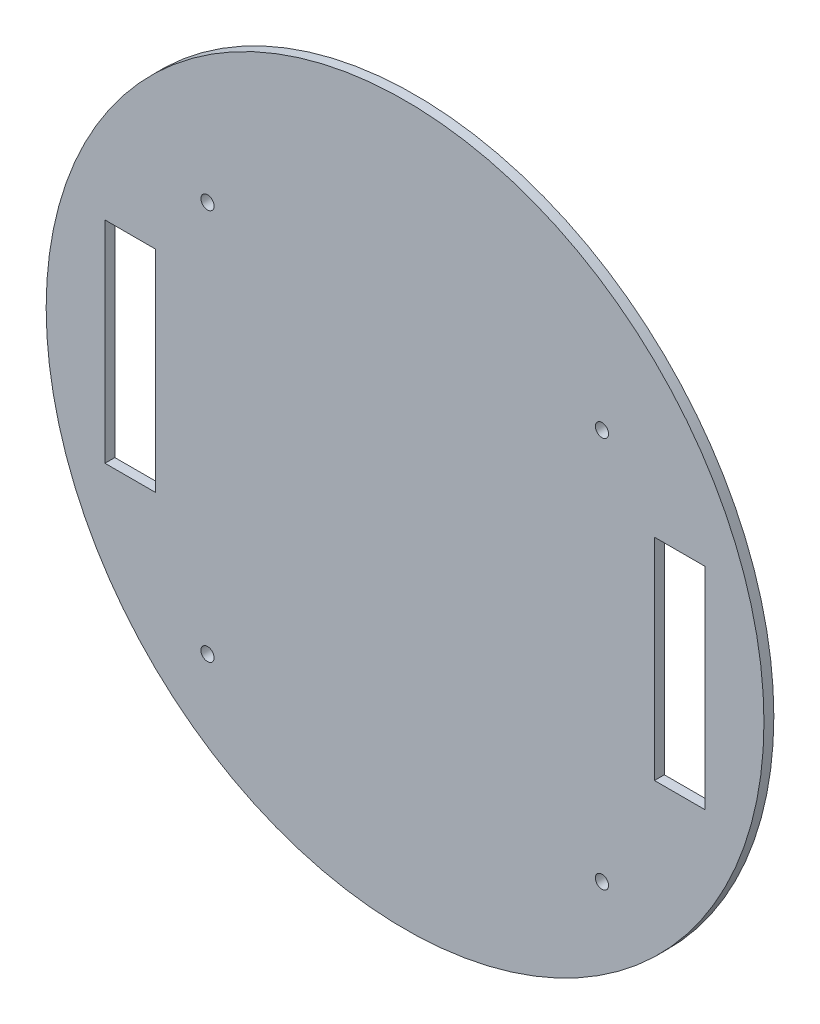
ISO-10303-21;
HEADER;
FILE_DESCRIPTION(('STEP AP214'),'2;1');
FILE_NAME('part.step','',(''),(''),'','','');
FILE_SCHEMA(('AUTOMOTIVE_DESIGN { 1 0 10303 214 1 1 1 1 }'));
ENDSEC;
DATA;
#1=APPLICATION_CONTEXT('core data for automotive mechanical design processes');
#2=APPLICATION_PROTOCOL_DEFINITION('international standard','automotive_design',2000,#1);
#3=PRODUCT_CONTEXT('',#1,'mechanical');
#4=PRODUCT('Part','Part','',(#3));
#5=PRODUCT_RELATED_PRODUCT_CATEGORY('part','',(#4));
#6=PRODUCT_DEFINITION_FORMATION('','',#4);
#7=PRODUCT_DEFINITION_CONTEXT('part definition',#1,'design');
#8=PRODUCT_DEFINITION('design','',#6,#7);
#9=PRODUCT_DEFINITION_SHAPE('','',#8);
#10=(LENGTH_UNIT() NAMED_UNIT(*) SI_UNIT(.MILLI.,.METRE.));
#11=(NAMED_UNIT(*) PLANE_ANGLE_UNIT() SI_UNIT($,.RADIAN.));
#12=(NAMED_UNIT(*) SI_UNIT($,.STERADIAN.) SOLID_ANGLE_UNIT());
#13=UNCERTAINTY_MEASURE_WITH_UNIT(LENGTH_MEASURE(1.E-05),#10,'distance_accuracy_value','');
#14=(GEOMETRIC_REPRESENTATION_CONTEXT(3) GLOBAL_UNCERTAINTY_ASSIGNED_CONTEXT((#13)) GLOBAL_UNIT_ASSIGNED_CONTEXT((#10,
#11,#12)) REPRESENTATION_CONTEXT('',''));
#15=CARTESIAN_POINT('',(0.,0.,0.));
#16=DIRECTION('',(0.,0.,1.));
#17=DIRECTION('',(1.,0.,0.));
#18=AXIS2_PLACEMENT_3D('',#15,#16,#17);
#19=CARTESIAN_POINT('',(0.,0.,1.5));
#20=DIRECTION('',(0.,0.,-1.));
#21=DIRECTION('',(-1.,0.,0.));
#22=AXIS2_PLACEMENT_3D('',#19,#20,#21);
#23=CYLINDRICAL_SURFACE('',#22,54.5);
#24=CARTESIAN_POINT('',(0.,0.,1.5));
#25=DIRECTION('',(0.,0.,1.));
#26=DIRECTION('',(1.,0.,0.));
#27=AXIS2_PLACEMENT_3D('',#24,#25,#26);
#28=CIRCLE('',#27,54.5);
#29=CARTESIAN_POINT('',(54.5,0.,1.5));
#30=VERTEX_POINT('',#29);
#31=EDGE_CURVE('E11',#30,#30,#28,.T.);
#32=ORIENTED_EDGE('',*,*,#31,.F.);
#33=EDGE_LOOP('',(#32));
#34=FACE_BOUND('',#33,.T.);
#35=CARTESIAN_POINT('',(0.,0.,0.));
#36=DIRECTION('',(0.,0.,1.));
#37=DIRECTION('',(1.,0.,0.));
#38=AXIS2_PLACEMENT_3D('',#35,#36,#37);
#39=CIRCLE('',#38,54.5);
#40=CARTESIAN_POINT('',(54.5,0.,0.));
#41=VERTEX_POINT('',#40);
#42=EDGE_CURVE('E42',#41,#41,#39,.T.);
#43=ORIENTED_EDGE('',*,*,#42,.T.);
#44=EDGE_LOOP('',(#43));
#45=FACE_BOUND('',#44,.T.);
#46=ADVANCED_FACE('F34',(#34,#45),#23,.T.);
#47=CARTESIAN_POINT('',(0.,0.,1.5));
#48=DIRECTION('',(0.,0.,1.));
#49=DIRECTION('',(1.,0.,0.));
#50=AXIS2_PLACEMENT_3D('',#47,#48,#49);
#51=PLANE('',#50);
#52=DIRECTION('',(0.,-1.,0.));
#53=VECTOR('',#52,1.);
#54=CARTESIAN_POINT('',(-45.5705,-16.,1.5));
#55=LINE('',#54,#53);
#56=CARTESIAN_POINT('',(-45.5705,16.,1.5));
#57=VERTEX_POINT('',#56);
#58=CARTESIAN_POINT('',(-45.5705,-16.,1.5));
#59=VERTEX_POINT('',#58);
#60=EDGE_CURVE('E50',#57,#59,#55,.T.);
#61=ORIENTED_EDGE('',*,*,#60,.F.);
#62=DIRECTION('',(-1.,0.,0.));
#63=VECTOR('',#62,1.);
#64=CARTESIAN_POINT('',(-45.5705,16.,1.5));
#65=LINE('',#64,#63);
#66=CARTESIAN_POINT('',(-37.8705,16.,1.5));
#67=VERTEX_POINT('',#66);
#68=EDGE_CURVE('E119',#67,#57,#65,.T.);
#69=ORIENTED_EDGE('',*,*,#68,.F.);
#70=DIRECTION('',(0.,1.,0.));
#71=VECTOR('',#70,1.);
#72=CARTESIAN_POINT('',(-37.8705,-16.,1.5));
#73=LINE('',#72,#71);
#74=CARTESIAN_POINT('',(-37.8705,-16.,1.5));
#75=VERTEX_POINT('',#74);
#76=EDGE_CURVE('E103',#75,#67,#73,.T.);
#77=ORIENTED_EDGE('',*,*,#76,.F.);
#78=DIRECTION('',(1.,0.,0.));
#79=VECTOR('',#78,1.);
#80=CARTESIAN_POINT('',(-45.5705,-16.,1.5));
#81=LINE('',#80,#79);
#82=EDGE_CURVE('E112',#59,#75,#81,.T.);
#83=ORIENTED_EDGE('',*,*,#82,.F.);
#84=EDGE_LOOP('',(#61,#69,#77,#83));
#85=FACE_BOUND('',#84,.T.);
#86=DIRECTION('',(0.,1.,0.));
#87=VECTOR('',#86,1.);
#88=CARTESIAN_POINT('',(45.5705,-16.,1.5));
#89=LINE('',#88,#87);
#90=CARTESIAN_POINT('',(45.5705,-16.,1.5));
#91=VERTEX_POINT('',#90);
#92=CARTESIAN_POINT('',(45.5705,16.,1.5));
#93=VERTEX_POINT('',#92);
#94=EDGE_CURVE('E130',#91,#93,#89,.T.);
#95=ORIENTED_EDGE('',*,*,#94,.F.);
#96=DIRECTION('',(1.,0.,0.));
#97=VECTOR('',#96,1.);
#98=CARTESIAN_POINT('',(45.5705,-16.,1.5));
#99=LINE('',#98,#97);
#100=CARTESIAN_POINT('',(37.8705,-16.,1.5));
#101=VERTEX_POINT('',#100);
#102=EDGE_CURVE('E148',#101,#91,#99,.T.);
#103=ORIENTED_EDGE('',*,*,#102,.F.);
#104=DIRECTION('',(0.,-1.,0.));
#105=VECTOR('',#104,1.);
#106=CARTESIAN_POINT('',(37.8705,-16.,1.5));
#107=LINE('',#106,#105);
#108=CARTESIAN_POINT('',(37.8705,16.,1.5));
#109=VERTEX_POINT('',#108);
#110=EDGE_CURVE('E145',#109,#101,#107,.T.);
#111=ORIENTED_EDGE('',*,*,#110,.F.);
#112=DIRECTION('',(-1.,0.,0.));
#113=VECTOR('',#112,1.);
#114=CARTESIAN_POINT('',(45.5705,16.,1.5));
#115=LINE('',#114,#113);
#116=EDGE_CURVE('E142',#93,#109,#115,.T.);
#117=ORIENTED_EDGE('',*,*,#116,.F.);
#118=EDGE_LOOP('',(#95,#103,#111,#117));
#119=FACE_BOUND('',#118,.T.);
#120=CARTESIAN_POINT('',(-29.9996014159269,26.1,1.5));
#121=DIRECTION('',(0.,0.,1.));
#122=DIRECTION('',(1.,0.,0.));
#123=AXIS2_PLACEMENT_3D('',#120,#121,#122);
#124=CIRCLE('',#123,1.);
#125=CARTESIAN_POINT('',(-28.9996014159269,26.1,1.5));
#126=VERTEX_POINT('',#125);
#127=EDGE_CURVE('E160',#126,#126,#124,.T.);
#128=ORIENTED_EDGE('',*,*,#127,.F.);
#129=EDGE_LOOP('',(#128));
#130=FACE_BOUND('',#129,.T.);
#131=CARTESIAN_POINT('',(-29.9996014159269,-33.3,1.5));
#132=DIRECTION('',(0.,0.,1.));
#133=DIRECTION('',(1.,0.,0.));
#134=AXIS2_PLACEMENT_3D('',#131,#132,#133);
#135=CIRCLE('',#134,1.);
#136=CARTESIAN_POINT('',(-28.9996014159269,-33.3,1.5));
#137=VERTEX_POINT('',#136);
#138=EDGE_CURVE('E163',#137,#137,#135,.T.);
#139=ORIENTED_EDGE('',*,*,#138,.F.);
#140=EDGE_LOOP('',(#139));
#141=FACE_BOUND('',#140,.T.);
#142=CARTESIAN_POINT('',(29.9003985840731,-33.3,1.5));
#143=DIRECTION('',(0.,0.,1.));
#144=DIRECTION('',(1.,0.,0.));
#145=AXIS2_PLACEMENT_3D('',#142,#143,#144);
#146=CIRCLE('',#145,0.999999999999995);
#147=CARTESIAN_POINT('',(30.9003985840731,-33.3,1.5));
#148=VERTEX_POINT('',#147);
#149=EDGE_CURVE('E167',#148,#148,#146,.T.);
#150=ORIENTED_EDGE('',*,*,#149,.F.);
#151=EDGE_LOOP('',(#150));
#152=FACE_BOUND('',#151,.T.);
#153=CARTESIAN_POINT('',(29.900398584073,26.1,1.5));
#154=DIRECTION('',(0.,0.,1.));
#155=DIRECTION('',(1.,0.,0.));
#156=AXIS2_PLACEMENT_3D('',#153,#154,#155);
#157=CIRCLE('',#156,0.999999999999994);
#158=CARTESIAN_POINT('',(30.900398584073,26.1,1.5));
#159=VERTEX_POINT('',#158);
#160=EDGE_CURVE('E171',#159,#159,#157,.T.);
#161=ORIENTED_EDGE('',*,*,#160,.F.);
#162=EDGE_LOOP('',(#161));
#163=FACE_BOUND('',#162,.T.);
#164=ORIENTED_EDGE('',*,*,#31,.T.);
#165=EDGE_LOOP('',(#164));
#166=FACE_BOUND('',#165,.T.);
#167=ADVANCED_FACE('F116',(#85,#119,#130,#141,#152,#163,#166),#51,.T.);
#168=CARTESIAN_POINT('',(0.,0.,0.));
#169=DIRECTION('',(0.,0.,1.));
#170=DIRECTION('',(1.,0.,0.));
#171=AXIS2_PLACEMENT_3D('',#168,#169,#170);
#172=PLANE('',#171);
#173=DIRECTION('',(1.,0.,0.));
#174=VECTOR('',#173,1.);
#175=CARTESIAN_POINT('',(-45.5705,16.,0.));
#176=LINE('',#175,#174);
#177=CARTESIAN_POINT('',(-45.5705,16.,0.));
#178=VERTEX_POINT('',#177);
#179=CARTESIAN_POINT('',(-37.8705,16.,0.));
#180=VERTEX_POINT('',#179);
#181=EDGE_CURVE('E222',#178,#180,#176,.T.);
#182=ORIENTED_EDGE('',*,*,#181,.F.);
#183=DIRECTION('',(0.,1.,0.));
#184=VECTOR('',#183,1.);
#185=CARTESIAN_POINT('',(-45.5705,-16.,0.));
#186=LINE('',#185,#184);
#187=CARTESIAN_POINT('',(-45.5705,-16.,0.));
#188=VERTEX_POINT('',#187);
#189=EDGE_CURVE('E131',#188,#178,#186,.T.);
#190=ORIENTED_EDGE('',*,*,#189,.F.);
#191=DIRECTION('',(-1.,0.,0.));
#192=VECTOR('',#191,1.);
#193=CARTESIAN_POINT('',(-45.5705,-16.,0.));
#194=LINE('',#193,#192);
#195=CARTESIAN_POINT('',(-37.8705,-16.,0.));
#196=VERTEX_POINT('',#195);
#197=EDGE_CURVE('E128',#196,#188,#194,.T.);
#198=ORIENTED_EDGE('',*,*,#197,.F.);
#199=DIRECTION('',(0.,-1.,0.));
#200=VECTOR('',#199,1.);
#201=CARTESIAN_POINT('',(-37.8705,-16.,0.));
#202=LINE('',#201,#200);
#203=EDGE_CURVE('E106',#180,#196,#202,.T.);
#204=ORIENTED_EDGE('',*,*,#203,.F.);
#205=EDGE_LOOP('',(#182,#190,#198,#204));
#206=FACE_BOUND('',#205,.T.);
#207=DIRECTION('',(-1.,0.,0.));
#208=VECTOR('',#207,1.);
#209=CARTESIAN_POINT('',(45.5705,-16.,0.));
#210=LINE('',#209,#208);
#211=CARTESIAN_POINT('',(45.5705,-16.,0.));
#212=VERTEX_POINT('',#211);
#213=CARTESIAN_POINT('',(37.8705,-16.,0.));
#214=VERTEX_POINT('',#213);
#215=EDGE_CURVE('E135',#212,#214,#210,.T.);
#216=ORIENTED_EDGE('',*,*,#215,.F.);
#217=DIRECTION('',(0.,-1.,0.));
#218=VECTOR('',#217,1.);
#219=CARTESIAN_POINT('',(45.5705,-16.,0.));
#220=LINE('',#219,#218);
#221=CARTESIAN_POINT('',(45.5705,16.,0.));
#222=VERTEX_POINT('',#221);
#223=EDGE_CURVE('E138',#222,#212,#220,.T.);
#224=ORIENTED_EDGE('',*,*,#223,.F.);
#225=DIRECTION('',(1.,0.,0.));
#226=VECTOR('',#225,1.);
#227=CARTESIAN_POINT('',(45.5705,16.,0.));
#228=LINE('',#227,#226);
#229=CARTESIAN_POINT('',(37.8705,16.,0.));
#230=VERTEX_POINT('',#229);
#231=EDGE_CURVE('E140',#230,#222,#228,.T.);
#232=ORIENTED_EDGE('',*,*,#231,.F.);
#233=DIRECTION('',(0.,1.,0.));
#234=VECTOR('',#233,1.);
#235=CARTESIAN_POINT('',(37.8705,-16.,0.));
#236=LINE('',#235,#234);
#237=EDGE_CURVE('E132',#214,#230,#236,.T.);
#238=ORIENTED_EDGE('',*,*,#237,.F.);
#239=EDGE_LOOP('',(#216,#224,#232,#238));
#240=FACE_BOUND('',#239,.T.);
#241=CARTESIAN_POINT('',(-29.9996014159269,26.1,0.));
#242=DIRECTION('',(0.,0.,1.));
#243=DIRECTION('',(1.,0.,0.));
#244=AXIS2_PLACEMENT_3D('',#241,#242,#243);
#245=CIRCLE('',#244,1.);
#246=CARTESIAN_POINT('',(-28.9996014159269,26.1,0.));
#247=VERTEX_POINT('',#246);
#248=EDGE_CURVE('E37',#247,#247,#245,.T.);
#249=ORIENTED_EDGE('',*,*,#248,.T.);
#250=EDGE_LOOP('',(#249));
#251=FACE_BOUND('',#250,.T.);
#252=CARTESIAN_POINT('',(-29.9996014159269,-33.3,0.));
#253=DIRECTION('',(0.,0.,1.));
#254=DIRECTION('',(1.,0.,0.));
#255=AXIS2_PLACEMENT_3D('',#252,#253,#254);
#256=CIRCLE('',#255,1.);
#257=CARTESIAN_POINT('',(-28.9996014159269,-33.3,0.));
#258=VERTEX_POINT('',#257);
#259=EDGE_CURVE('E166',#258,#258,#256,.T.);
#260=ORIENTED_EDGE('',*,*,#259,.T.);
#261=EDGE_LOOP('',(#260));
#262=FACE_BOUND('',#261,.T.);
#263=CARTESIAN_POINT('',(29.9003985840731,-33.3,0.));
#264=DIRECTION('',(0.,0.,1.));
#265=DIRECTION('',(1.,0.,0.));
#266=AXIS2_PLACEMENT_3D('',#263,#264,#265);
#267=CIRCLE('',#266,0.999999999999995);
#268=CARTESIAN_POINT('',(30.9003985840731,-33.3,0.));
#269=VERTEX_POINT('',#268);
#270=EDGE_CURVE('E170',#269,#269,#267,.T.);
#271=ORIENTED_EDGE('',*,*,#270,.T.);
#272=EDGE_LOOP('',(#271));
#273=FACE_BOUND('',#272,.T.);
#274=CARTESIAN_POINT('',(29.900398584073,26.1,0.));
#275=DIRECTION('',(0.,0.,1.));
#276=DIRECTION('',(1.,0.,0.));
#277=AXIS2_PLACEMENT_3D('',#274,#275,#276);
#278=CIRCLE('',#277,0.999999999999994);
#279=CARTESIAN_POINT('',(30.900398584073,26.1,0.));
#280=VERTEX_POINT('',#279);
#281=EDGE_CURVE('E173',#280,#280,#278,.T.);
#282=ORIENTED_EDGE('',*,*,#281,.T.);
#283=EDGE_LOOP('',(#282));
#284=FACE_BOUND('',#283,.T.);
#285=ORIENTED_EDGE('',*,*,#42,.F.);
#286=EDGE_LOOP('',(#285));
#287=FACE_BOUND('',#286,.T.);
#288=ADVANCED_FACE('F183',(#206,#240,#251,#262,#273,#284,#287),#172,.F.);
#289=CARTESIAN_POINT('',(29.900398584073,26.1,-0.08));
#290=DIRECTION('',(0.,0.,1.));
#291=DIRECTION('',(1.,0.,0.));
#292=AXIS2_PLACEMENT_3D('',#289,#290,#291);
#293=CYLINDRICAL_SURFACE('',#292,0.999999999999994);
#294=CARTESIAN_POINT('',(30.900398584073,26.1,1.5));
#295=CARTESIAN_POINT('',(30.900398584073,26.1,1.484375));
#296=CARTESIAN_POINT('',(30.900398584073,26.1,1.46875));
#297=CARTESIAN_POINT('',(30.900398584073,26.1,1.4375));
#298=CARTESIAN_POINT('',(30.900398584073,26.1,1.421875));
#299=CARTESIAN_POINT('',(30.900398584073,26.1,1.390625));
#300=CARTESIAN_POINT('',(30.900398584073,26.1,1.375));
#301=CARTESIAN_POINT('',(30.900398584073,26.1,1.34375));
#302=CARTESIAN_POINT('',(30.900398584073,26.1,1.328125));
#303=CARTESIAN_POINT('',(30.900398584073,26.1,1.296875));
#304=CARTESIAN_POINT('',(30.900398584073,26.1,1.28125));
#305=CARTESIAN_POINT('',(30.900398584073,26.1,1.25));
#306=CARTESIAN_POINT('',(30.900398584073,26.1,1.234375));
#307=CARTESIAN_POINT('',(30.900398584073,26.1,1.203125));
#308=CARTESIAN_POINT('',(30.900398584073,26.1,1.1875));
#309=CARTESIAN_POINT('',(30.900398584073,26.1,1.15625));
#310=CARTESIAN_POINT('',(30.900398584073,26.1,1.140625));
#311=CARTESIAN_POINT('',(30.900398584073,26.1,1.109375));
#312=CARTESIAN_POINT('',(30.900398584073,26.1,1.09375));
#313=CARTESIAN_POINT('',(30.900398584073,26.1,1.0625));
#314=CARTESIAN_POINT('',(30.900398584073,26.1,1.046875));
#315=CARTESIAN_POINT('',(30.900398584073,26.1,1.015625));
#316=CARTESIAN_POINT('',(30.900398584073,26.1,1.));
#317=CARTESIAN_POINT('',(30.900398584073,26.1,0.96875));
#318=CARTESIAN_POINT('',(30.900398584073,26.1,0.953125));
#319=CARTESIAN_POINT('',(30.900398584073,26.1,0.921875));
#320=CARTESIAN_POINT('',(30.900398584073,26.1,0.90625));
#321=CARTESIAN_POINT('',(30.900398584073,26.1,0.875));
#322=CARTESIAN_POINT('',(30.900398584073,26.1,0.859375));
#323=CARTESIAN_POINT('',(30.900398584073,26.1,0.828125));
#324=CARTESIAN_POINT('',(30.900398584073,26.1,0.8125));
#325=CARTESIAN_POINT('',(30.900398584073,26.1,0.78125));
#326=CARTESIAN_POINT('',(30.900398584073,26.1,0.765625));
#327=CARTESIAN_POINT('',(30.900398584073,26.1,0.734375));
#328=CARTESIAN_POINT('',(30.900398584073,26.1,0.71875));
#329=CARTESIAN_POINT('',(30.900398584073,26.1,0.6875));
#330=CARTESIAN_POINT('',(30.900398584073,26.1,0.671875));
#331=CARTESIAN_POINT('',(30.900398584073,26.1,0.640625));
#332=CARTESIAN_POINT('',(30.900398584073,26.1,0.625));
#333=CARTESIAN_POINT('',(30.900398584073,26.1,0.59375));
#334=CARTESIAN_POINT('',(30.900398584073,26.1,0.578125));
#335=CARTESIAN_POINT('',(30.900398584073,26.1,0.546875));
#336=CARTESIAN_POINT('',(30.900398584073,26.1,0.53125));
#337=CARTESIAN_POINT('',(30.900398584073,26.1,0.5));
#338=CARTESIAN_POINT('',(30.900398584073,26.1,0.484375));
#339=CARTESIAN_POINT('',(30.900398584073,26.1,0.453125));
#340=CARTESIAN_POINT('',(30.900398584073,26.1,0.4375));
#341=CARTESIAN_POINT('',(30.900398584073,26.1,0.40625));
#342=CARTESIAN_POINT('',(30.900398584073,26.1,0.390625));
#343=CARTESIAN_POINT('',(30.900398584073,26.1,0.359375));
#344=CARTESIAN_POINT('',(30.900398584073,26.1,0.34375));
#345=CARTESIAN_POINT('',(30.900398584073,26.1,0.3125));
#346=CARTESIAN_POINT('',(30.900398584073,26.1,0.296875));
#347=CARTESIAN_POINT('',(30.900398584073,26.1,0.265625));
#348=CARTESIAN_POINT('',(30.900398584073,26.1,0.25));
#349=CARTESIAN_POINT('',(30.900398584073,26.1,0.21875));
#350=CARTESIAN_POINT('',(30.900398584073,26.1,0.203125));
#351=CARTESIAN_POINT('',(30.900398584073,26.1,0.171875));
#352=CARTESIAN_POINT('',(30.900398584073,26.1,0.15625));
#353=CARTESIAN_POINT('',(30.900398584073,26.1,0.125));
#354=CARTESIAN_POINT('',(30.900398584073,26.1,0.109375));
#355=CARTESIAN_POINT('',(30.900398584073,26.1,0.078125));
#356=CARTESIAN_POINT('',(30.900398584073,26.1,0.0625));
#357=CARTESIAN_POINT('',(30.900398584073,26.1,0.03125));
#358=CARTESIAN_POINT('',(30.900398584073,26.1,0.015625));
#359=CARTESIAN_POINT('',(30.900398584073,26.1,0.));
#360=B_SPLINE_CURVE_WITH_KNOTS('',3,(#294,#295,#296,#297,#298,#299,#300,#301,#302,#303,#304,
#305,#306,#307,#308,#309,#310,#311,#312,#313,#314,#315,#316,#317,#318,#319,#320,#321,#322,#323,
#324,#325,#326,#327,#328,#329,#330,#331,#332,#333,#334,#335,#336,#337,#338,#339,#340,#341,#342,
#343,#344,#345,#346,#347,#348,#349,#350,#351,#352,#353,#354,#355,#356,#357,#358,#359),
.UNSPECIFIED.,.F.,.F.,(4,2,2,2,2,2,2,2,2,2,2,2,2,2,2,2,2,2,2,2,2,2,2,2,2,2,2,2,2,2,2,2,4),(0.,
0.046875,0.0937500000000001,0.140625,0.1875,0.234375,0.28125,0.328125,0.375,0.421875,0.46875,
0.515625,0.5625,0.609375,0.65625,0.703125,0.75,0.796875,0.84375,0.890625,0.9375,0.984375,
1.03125,1.078125,1.125,1.171875,1.21875,1.265625,1.3125,1.359375,1.40625,1.453125,1.5),.UNSPECIFIED.);
#361=EDGE_CURVE('BSEAM199',#159,#280,#360,.T.);
#362=ORIENTED_EDGE('',*,*,#160,.T.);
#363=ORIENTED_EDGE('',*,*,#281,.F.);
#364=ORIENTED_EDGE('',*,*,#361,.T.);
#365=ORIENTED_EDGE('',*,*,#361,.F.);
#366=EDGE_LOOP('',(#362,#364,#363,#365));
#367=FACE_BOUND('',#366,.T.);
#368=ADVANCED_FACE('F199',(#367),#293,.F.);
#369=CARTESIAN_POINT('',(29.9003985840731,-33.3,-0.08));
#370=DIRECTION('',(0.,0.,1.));
#371=DIRECTION('',(1.,0.,0.));
#372=AXIS2_PLACEMENT_3D('',#369,#370,#371);
#373=CYLINDRICAL_SURFACE('',#372,0.999999999999995);
#374=CARTESIAN_POINT('',(30.9003985840731,-33.3,1.5));
#375=CARTESIAN_POINT('',(30.9003985840731,-33.3,1.484375));
#376=CARTESIAN_POINT('',(30.9003985840731,-33.3,1.46875));
#377=CARTESIAN_POINT('',(30.9003985840731,-33.3,1.4375));
#378=CARTESIAN_POINT('',(30.9003985840731,-33.3,1.421875));
#379=CARTESIAN_POINT('',(30.9003985840731,-33.3,1.390625));
#380=CARTESIAN_POINT('',(30.9003985840731,-33.3,1.375));
#381=CARTESIAN_POINT('',(30.9003985840731,-33.3,1.34375));
#382=CARTESIAN_POINT('',(30.9003985840731,-33.3,1.328125));
#383=CARTESIAN_POINT('',(30.9003985840731,-33.3,1.296875));
#384=CARTESIAN_POINT('',(30.9003985840731,-33.3,1.28125));
#385=CARTESIAN_POINT('',(30.9003985840731,-33.3,1.25));
#386=CARTESIAN_POINT('',(30.9003985840731,-33.3,1.234375));
#387=CARTESIAN_POINT('',(30.9003985840731,-33.3,1.203125));
#388=CARTESIAN_POINT('',(30.9003985840731,-33.3,1.1875));
#389=CARTESIAN_POINT('',(30.9003985840731,-33.3,1.15625));
#390=CARTESIAN_POINT('',(30.9003985840731,-33.3,1.140625));
#391=CARTESIAN_POINT('',(30.9003985840731,-33.3,1.109375));
#392=CARTESIAN_POINT('',(30.9003985840731,-33.3,1.09375));
#393=CARTESIAN_POINT('',(30.9003985840731,-33.3,1.0625));
#394=CARTESIAN_POINT('',(30.9003985840731,-33.3,1.046875));
#395=CARTESIAN_POINT('',(30.9003985840731,-33.3,1.015625));
#396=CARTESIAN_POINT('',(30.9003985840731,-33.3,1.));
#397=CARTESIAN_POINT('',(30.9003985840731,-33.3,0.96875));
#398=CARTESIAN_POINT('',(30.9003985840731,-33.3,0.953125));
#399=CARTESIAN_POINT('',(30.9003985840731,-33.3,0.921875));
#400=CARTESIAN_POINT('',(30.9003985840731,-33.3,0.90625));
#401=CARTESIAN_POINT('',(30.9003985840731,-33.3,0.875));
#402=CARTESIAN_POINT('',(30.9003985840731,-33.3,0.859375));
#403=CARTESIAN_POINT('',(30.9003985840731,-33.3,0.828125));
#404=CARTESIAN_POINT('',(30.9003985840731,-33.3,0.8125));
#405=CARTESIAN_POINT('',(30.9003985840731,-33.3,0.78125));
#406=CARTESIAN_POINT('',(30.9003985840731,-33.3,0.765625));
#407=CARTESIAN_POINT('',(30.9003985840731,-33.3,0.734375));
#408=CARTESIAN_POINT('',(30.9003985840731,-33.3,0.71875));
#409=CARTESIAN_POINT('',(30.9003985840731,-33.3,0.6875));
#410=CARTESIAN_POINT('',(30.9003985840731,-33.3,0.671875));
#411=CARTESIAN_POINT('',(30.9003985840731,-33.3,0.640625));
#412=CARTESIAN_POINT('',(30.9003985840731,-33.3,0.625));
#413=CARTESIAN_POINT('',(30.9003985840731,-33.3,0.59375));
#414=CARTESIAN_POINT('',(30.9003985840731,-33.3,0.578125));
#415=CARTESIAN_POINT('',(30.9003985840731,-33.3,0.546875));
#416=CARTESIAN_POINT('',(30.9003985840731,-33.3,0.53125));
#417=CARTESIAN_POINT('',(30.9003985840731,-33.3,0.5));
#418=CARTESIAN_POINT('',(30.9003985840731,-33.3,0.484375));
#419=CARTESIAN_POINT('',(30.9003985840731,-33.3,0.453125));
#420=CARTESIAN_POINT('',(30.9003985840731,-33.3,0.4375));
#421=CARTESIAN_POINT('',(30.9003985840731,-33.3,0.40625));
#422=CARTESIAN_POINT('',(30.9003985840731,-33.3,0.390625));
#423=CARTESIAN_POINT('',(30.9003985840731,-33.3,0.359375));
#424=CARTESIAN_POINT('',(30.9003985840731,-33.3,0.34375));
#425=CARTESIAN_POINT('',(30.9003985840731,-33.3,0.3125));
#426=CARTESIAN_POINT('',(30.9003985840731,-33.3,0.296875));
#427=CARTESIAN_POINT('',(30.9003985840731,-33.3,0.265625));
#428=CARTESIAN_POINT('',(30.9003985840731,-33.3,0.25));
#429=CARTESIAN_POINT('',(30.9003985840731,-33.3,0.21875));
#430=CARTESIAN_POINT('',(30.9003985840731,-33.3,0.203125));
#431=CARTESIAN_POINT('',(30.9003985840731,-33.3,0.171875));
#432=CARTESIAN_POINT('',(30.9003985840731,-33.3,0.15625));
#433=CARTESIAN_POINT('',(30.9003985840731,-33.3,0.125));
#434=CARTESIAN_POINT('',(30.9003985840731,-33.3,0.109375));
#435=CARTESIAN_POINT('',(30.9003985840731,-33.3,0.078125));
#436=CARTESIAN_POINT('',(30.9003985840731,-33.3,0.0625));
#437=CARTESIAN_POINT('',(30.9003985840731,-33.3,0.03125));
#438=CARTESIAN_POINT('',(30.9003985840731,-33.3,0.015625));
#439=CARTESIAN_POINT('',(30.9003985840731,-33.3,0.));
#440=B_SPLINE_CURVE_WITH_KNOTS('',3,(#374,#375,#376,#377,#378,#379,#380,#381,#382,#383,#384,
#385,#386,#387,#388,#389,#390,#391,#392,#393,#394,#395,#396,#397,#398,#399,#400,#401,#402,#403,
#404,#405,#406,#407,#408,#409,#410,#411,#412,#413,#414,#415,#416,#417,#418,#419,#420,#421,#422,
#423,#424,#425,#426,#427,#428,#429,#430,#431,#432,#433,#434,#435,#436,#437,#438,#439),
.UNSPECIFIED.,.F.,.F.,(4,2,2,2,2,2,2,2,2,2,2,2,2,2,2,2,2,2,2,2,2,2,2,2,2,2,2,2,2,2,2,2,4),(0.,
0.046875,0.0937500000000001,0.140625,0.1875,0.234375,0.28125,0.328125,0.375,0.421875,0.46875,
0.515625,0.5625,0.609375,0.65625,0.703125,0.75,0.796875,0.84375,0.890625,0.9375,0.984375,
1.03125,1.078125,1.125,1.171875,1.21875,1.265625,1.3125,1.359375,1.40625,1.453125,1.5),.UNSPECIFIED.);
#441=EDGE_CURVE('BSEAM189',#148,#269,#440,.T.);
#442=ORIENTED_EDGE('',*,*,#149,.T.);
#443=ORIENTED_EDGE('',*,*,#270,.F.);
#444=ORIENTED_EDGE('',*,*,#441,.T.);
#445=ORIENTED_EDGE('',*,*,#441,.F.);
#446=EDGE_LOOP('',(#442,#444,#443,#445));
#447=FACE_BOUND('',#446,.T.);
#448=ADVANCED_FACE('F189',(#447),#373,.F.);
#449=CARTESIAN_POINT('',(-29.9996014159269,-33.3,-0.08));
#450=DIRECTION('',(0.,0.,1.));
#451=DIRECTION('',(1.,0.,0.));
#452=AXIS2_PLACEMENT_3D('',#449,#450,#451);
#453=CYLINDRICAL_SURFACE('',#452,1.);
#454=CARTESIAN_POINT('',(-28.9996014159269,-33.3,1.5));
#455=CARTESIAN_POINT('',(-28.9996014159269,-33.3,1.484375));
#456=CARTESIAN_POINT('',(-28.9996014159269,-33.3,1.46875));
#457=CARTESIAN_POINT('',(-28.9996014159269,-33.3,1.4375));
#458=CARTESIAN_POINT('',(-28.9996014159269,-33.3,1.421875));
#459=CARTESIAN_POINT('',(-28.9996014159269,-33.3,1.390625));
#460=CARTESIAN_POINT('',(-28.9996014159269,-33.3,1.375));
#461=CARTESIAN_POINT('',(-28.9996014159269,-33.3,1.34375));
#462=CARTESIAN_POINT('',(-28.9996014159269,-33.3,1.328125));
#463=CARTESIAN_POINT('',(-28.9996014159269,-33.3,1.296875));
#464=CARTESIAN_POINT('',(-28.9996014159269,-33.3,1.28125));
#465=CARTESIAN_POINT('',(-28.9996014159269,-33.3,1.25));
#466=CARTESIAN_POINT('',(-28.9996014159269,-33.3,1.234375));
#467=CARTESIAN_POINT('',(-28.9996014159269,-33.3,1.203125));
#468=CARTESIAN_POINT('',(-28.9996014159269,-33.3,1.1875));
#469=CARTESIAN_POINT('',(-28.9996014159269,-33.3,1.15625));
#470=CARTESIAN_POINT('',(-28.9996014159269,-33.3,1.140625));
#471=CARTESIAN_POINT('',(-28.9996014159269,-33.3,1.109375));
#472=CARTESIAN_POINT('',(-28.9996014159269,-33.3,1.09375));
#473=CARTESIAN_POINT('',(-28.9996014159269,-33.3,1.0625));
#474=CARTESIAN_POINT('',(-28.9996014159269,-33.3,1.046875));
#475=CARTESIAN_POINT('',(-28.9996014159269,-33.3,1.015625));
#476=CARTESIAN_POINT('',(-28.9996014159269,-33.3,1.));
#477=CARTESIAN_POINT('',(-28.9996014159269,-33.3,0.96875));
#478=CARTESIAN_POINT('',(-28.9996014159269,-33.3,0.953125));
#479=CARTESIAN_POINT('',(-28.9996014159269,-33.3,0.921875));
#480=CARTESIAN_POINT('',(-28.9996014159269,-33.3,0.90625));
#481=CARTESIAN_POINT('',(-28.9996014159269,-33.3,0.875));
#482=CARTESIAN_POINT('',(-28.9996014159269,-33.3,0.859375));
#483=CARTESIAN_POINT('',(-28.9996014159269,-33.3,0.828125));
#484=CARTESIAN_POINT('',(-28.9996014159269,-33.3,0.8125));
#485=CARTESIAN_POINT('',(-28.9996014159269,-33.3,0.78125));
#486=CARTESIAN_POINT('',(-28.9996014159269,-33.3,0.765625));
#487=CARTESIAN_POINT('',(-28.9996014159269,-33.3,0.734375));
#488=CARTESIAN_POINT('',(-28.9996014159269,-33.3,0.71875));
#489=CARTESIAN_POINT('',(-28.9996014159269,-33.3,0.6875));
#490=CARTESIAN_POINT('',(-28.9996014159269,-33.3,0.671875));
#491=CARTESIAN_POINT('',(-28.9996014159269,-33.3,0.640625));
#492=CARTESIAN_POINT('',(-28.9996014159269,-33.3,0.625));
#493=CARTESIAN_POINT('',(-28.9996014159269,-33.3,0.59375));
#494=CARTESIAN_POINT('',(-28.9996014159269,-33.3,0.578125));
#495=CARTESIAN_POINT('',(-28.9996014159269,-33.3,0.546875));
#496=CARTESIAN_POINT('',(-28.9996014159269,-33.3,0.53125));
#497=CARTESIAN_POINT('',(-28.9996014159269,-33.3,0.5));
#498=CARTESIAN_POINT('',(-28.9996014159269,-33.3,0.484375));
#499=CARTESIAN_POINT('',(-28.9996014159269,-33.3,0.453125));
#500=CARTESIAN_POINT('',(-28.9996014159269,-33.3,0.4375));
#501=CARTESIAN_POINT('',(-28.9996014159269,-33.3,0.40625));
#502=CARTESIAN_POINT('',(-28.9996014159269,-33.3,0.390625));
#503=CARTESIAN_POINT('',(-28.9996014159269,-33.3,0.359375));
#504=CARTESIAN_POINT('',(-28.9996014159269,-33.3,0.34375));
#505=CARTESIAN_POINT('',(-28.9996014159269,-33.3,0.3125));
#506=CARTESIAN_POINT('',(-28.9996014159269,-33.3,0.296875));
#507=CARTESIAN_POINT('',(-28.9996014159269,-33.3,0.265625));
#508=CARTESIAN_POINT('',(-28.9996014159269,-33.3,0.25));
#509=CARTESIAN_POINT('',(-28.9996014159269,-33.3,0.21875));
#510=CARTESIAN_POINT('',(-28.9996014159269,-33.3,0.203125));
#511=CARTESIAN_POINT('',(-28.9996014159269,-33.3,0.171875));
#512=CARTESIAN_POINT('',(-28.9996014159269,-33.3,0.15625));
#513=CARTESIAN_POINT('',(-28.9996014159269,-33.3,0.125));
#514=CARTESIAN_POINT('',(-28.9996014159269,-33.3,0.109375));
#515=CARTESIAN_POINT('',(-28.9996014159269,-33.3,0.078125));
#516=CARTESIAN_POINT('',(-28.9996014159269,-33.3,0.0625));
#517=CARTESIAN_POINT('',(-28.9996014159269,-33.3,0.03125));
#518=CARTESIAN_POINT('',(-28.9996014159269,-33.3,0.015625));
#519=CARTESIAN_POINT('',(-28.9996014159269,-33.3,0.));
#520=B_SPLINE_CURVE_WITH_KNOTS('',3,(#454,#455,#456,#457,#458,#459,#460,#461,#462,#463,#464,
#465,#466,#467,#468,#469,#470,#471,#472,#473,#474,#475,#476,#477,#478,#479,#480,#481,#482,#483,
#484,#485,#486,#487,#488,#489,#490,#491,#492,#493,#494,#495,#496,#497,#498,#499,#500,#501,#502,
#503,#504,#505,#506,#507,#508,#509,#510,#511,#512,#513,#514,#515,#516,#517,#518,#519),
.UNSPECIFIED.,.F.,.F.,(4,2,2,2,2,2,2,2,2,2,2,2,2,2,2,2,2,2,2,2,2,2,2,2,2,2,2,2,2,2,2,2,4),(0.,
0.046875,0.0937500000000001,0.140625,0.1875,0.234375,0.28125,0.328125,0.375,0.421875,0.46875,
0.515625,0.5625,0.609375,0.65625,0.703125,0.75,0.796875,0.84375,0.890625,0.9375,0.984375,
1.03125,1.078125,1.125,1.171875,1.21875,1.265625,1.3125,1.359375,1.40625,1.453125,1.5),.UNSPECIFIED.);
#521=EDGE_CURVE('BSEAM186',#137,#258,#520,.T.);
#522=ORIENTED_EDGE('',*,*,#138,.T.);
#523=ORIENTED_EDGE('',*,*,#259,.F.);
#524=ORIENTED_EDGE('',*,*,#521,.T.);
#525=ORIENTED_EDGE('',*,*,#521,.F.);
#526=EDGE_LOOP('',(#522,#524,#523,#525));
#527=FACE_BOUND('',#526,.T.);
#528=ADVANCED_FACE('F186',(#527),#453,.F.);
#529=CARTESIAN_POINT('',(-29.9996014159269,26.1,-0.08));
#530=DIRECTION('',(0.,0.,1.));
#531=DIRECTION('',(1.,0.,0.));
#532=AXIS2_PLACEMENT_3D('',#529,#530,#531);
#533=CYLINDRICAL_SURFACE('',#532,1.);
#534=CARTESIAN_POINT('',(-28.9996014159269,26.1,1.5));
#535=CARTESIAN_POINT('',(-28.9996014159269,26.1,1.484375));
#536=CARTESIAN_POINT('',(-28.9996014159269,26.1,1.46875));
#537=CARTESIAN_POINT('',(-28.9996014159269,26.1,1.4375));
#538=CARTESIAN_POINT('',(-28.9996014159269,26.1,1.421875));
#539=CARTESIAN_POINT('',(-28.9996014159269,26.1,1.390625));
#540=CARTESIAN_POINT('',(-28.9996014159269,26.1,1.375));
#541=CARTESIAN_POINT('',(-28.9996014159269,26.1,1.34375));
#542=CARTESIAN_POINT('',(-28.9996014159269,26.1,1.328125));
#543=CARTESIAN_POINT('',(-28.9996014159269,26.1,1.296875));
#544=CARTESIAN_POINT('',(-28.9996014159269,26.1,1.28125));
#545=CARTESIAN_POINT('',(-28.9996014159269,26.1,1.25));
#546=CARTESIAN_POINT('',(-28.9996014159269,26.1,1.234375));
#547=CARTESIAN_POINT('',(-28.9996014159269,26.1,1.203125));
#548=CARTESIAN_POINT('',(-28.9996014159269,26.1,1.1875));
#549=CARTESIAN_POINT('',(-28.9996014159269,26.1,1.15625));
#550=CARTESIAN_POINT('',(-28.9996014159269,26.1,1.140625));
#551=CARTESIAN_POINT('',(-28.9996014159269,26.1,1.109375));
#552=CARTESIAN_POINT('',(-28.9996014159269,26.1,1.09375));
#553=CARTESIAN_POINT('',(-28.9996014159269,26.1,1.0625));
#554=CARTESIAN_POINT('',(-28.9996014159269,26.1,1.046875));
#555=CARTESIAN_POINT('',(-28.9996014159269,26.1,1.015625));
#556=CARTESIAN_POINT('',(-28.9996014159269,26.1,1.));
#557=CARTESIAN_POINT('',(-28.9996014159269,26.1,0.96875));
#558=CARTESIAN_POINT('',(-28.9996014159269,26.1,0.953125));
#559=CARTESIAN_POINT('',(-28.9996014159269,26.1,0.921875));
#560=CARTESIAN_POINT('',(-28.9996014159269,26.1,0.90625));
#561=CARTESIAN_POINT('',(-28.9996014159269,26.1,0.875));
#562=CARTESIAN_POINT('',(-28.9996014159269,26.1,0.859375));
#563=CARTESIAN_POINT('',(-28.9996014159269,26.1,0.828125));
#564=CARTESIAN_POINT('',(-28.9996014159269,26.1,0.8125));
#565=CARTESIAN_POINT('',(-28.9996014159269,26.1,0.78125));
#566=CARTESIAN_POINT('',(-28.9996014159269,26.1,0.765625));
#567=CARTESIAN_POINT('',(-28.9996014159269,26.1,0.734375));
#568=CARTESIAN_POINT('',(-28.9996014159269,26.1,0.71875));
#569=CARTESIAN_POINT('',(-28.9996014159269,26.1,0.6875));
#570=CARTESIAN_POINT('',(-28.9996014159269,26.1,0.671875));
#571=CARTESIAN_POINT('',(-28.9996014159269,26.1,0.640625));
#572=CARTESIAN_POINT('',(-28.9996014159269,26.1,0.625));
#573=CARTESIAN_POINT('',(-28.9996014159269,26.1,0.59375));
#574=CARTESIAN_POINT('',(-28.9996014159269,26.1,0.578125));
#575=CARTESIAN_POINT('',(-28.9996014159269,26.1,0.546875));
#576=CARTESIAN_POINT('',(-28.9996014159269,26.1,0.53125));
#577=CARTESIAN_POINT('',(-28.9996014159269,26.1,0.5));
#578=CARTESIAN_POINT('',(-28.9996014159269,26.1,0.484375));
#579=CARTESIAN_POINT('',(-28.9996014159269,26.1,0.453125));
#580=CARTESIAN_POINT('',(-28.9996014159269,26.1,0.4375));
#581=CARTESIAN_POINT('',(-28.9996014159269,26.1,0.40625));
#582=CARTESIAN_POINT('',(-28.9996014159269,26.1,0.390625));
#583=CARTESIAN_POINT('',(-28.9996014159269,26.1,0.359375));
#584=CARTESIAN_POINT('',(-28.9996014159269,26.1,0.34375));
#585=CARTESIAN_POINT('',(-28.9996014159269,26.1,0.3125));
#586=CARTESIAN_POINT('',(-28.9996014159269,26.1,0.296875));
#587=CARTESIAN_POINT('',(-28.9996014159269,26.1,0.265625));
#588=CARTESIAN_POINT('',(-28.9996014159269,26.1,0.25));
#589=CARTESIAN_POINT('',(-28.9996014159269,26.1,0.21875));
#590=CARTESIAN_POINT('',(-28.9996014159269,26.1,0.203125));
#591=CARTESIAN_POINT('',(-28.9996014159269,26.1,0.171875));
#592=CARTESIAN_POINT('',(-28.9996014159269,26.1,0.15625));
#593=CARTESIAN_POINT('',(-28.9996014159269,26.1,0.125));
#594=CARTESIAN_POINT('',(-28.9996014159269,26.1,0.109375));
#595=CARTESIAN_POINT('',(-28.9996014159269,26.1,0.078125));
#596=CARTESIAN_POINT('',(-28.9996014159269,26.1,0.0625));
#597=CARTESIAN_POINT('',(-28.9996014159269,26.1,0.03125));
#598=CARTESIAN_POINT('',(-28.9996014159269,26.1,0.015625));
#599=CARTESIAN_POINT('',(-28.9996014159269,26.1,0.));
#600=B_SPLINE_CURVE_WITH_KNOTS('',3,(#534,#535,#536,#537,#538,#539,#540,#541,#542,#543,#544,
#545,#546,#547,#548,#549,#550,#551,#552,#553,#554,#555,#556,#557,#558,#559,#560,#561,#562,#563,
#564,#565,#566,#567,#568,#569,#570,#571,#572,#573,#574,#575,#576,#577,#578,#579,#580,#581,#582,
#583,#584,#585,#586,#587,#588,#589,#590,#591,#592,#593,#594,#595,#596,#597,#598,#599),
.UNSPECIFIED.,.F.,.F.,(4,2,2,2,2,2,2,2,2,2,2,2,2,2,2,2,2,2,2,2,2,2,2,2,2,2,2,2,2,2,2,2,4),(0.,
0.046875,0.0937500000000001,0.140625,0.1875,0.234375,0.28125,0.328125,0.375,0.421875,0.46875,
0.515625,0.5625,0.609375,0.65625,0.703125,0.75,0.796875,0.84375,0.890625,0.9375,0.984375,
1.03125,1.078125,1.125,1.171875,1.21875,1.265625,1.3125,1.359375,1.40625,1.453125,1.5),.UNSPECIFIED.);
#601=EDGE_CURVE('BSEAM188',#126,#247,#600,.T.);
#602=ORIENTED_EDGE('',*,*,#127,.T.);
#603=ORIENTED_EDGE('',*,*,#248,.F.);
#604=ORIENTED_EDGE('',*,*,#601,.T.);
#605=ORIENTED_EDGE('',*,*,#601,.F.);
#606=EDGE_LOOP('',(#602,#604,#603,#605));
#607=FACE_BOUND('',#606,.T.);
#608=ADVANCED_FACE('F188',(#607),#533,.F.);
#609=CARTESIAN_POINT('',(45.5705,-16.,-32.9133711430476));
#610=DIRECTION('',(1.,0.,0.));
#611=DIRECTION('',(0.,1.,0.));
#612=AXIS2_PLACEMENT_3D('',#609,#610,#611);
#613=PLANE('',#612);
#614=ORIENTED_EDGE('',*,*,#223,.T.);
#615=DIRECTION('',(0.,0.,1.));
#616=VECTOR('',#615,1.);
#617=CARTESIAN_POINT('',(45.5705,-16.,-32.9133711430476));
#618=LINE('',#617,#616);
#619=EDGE_CURVE('E136',#212,#91,#618,.T.);
#620=ORIENTED_EDGE('',*,*,#619,.T.);
#621=ORIENTED_EDGE('',*,*,#94,.T.);
#622=DIRECTION('',(0.,0.,1.));
#623=VECTOR('',#622,1.);
#624=CARTESIAN_POINT('',(45.5705,16.,-32.9133711430476));
#625=LINE('',#624,#623);
#626=EDGE_CURVE('E151',#222,#93,#625,.T.);
#627=ORIENTED_EDGE('',*,*,#626,.F.);
#628=EDGE_LOOP('',(#614,#620,#621,#627));
#629=FACE_BOUND('',#628,.T.);
#630=ADVANCED_FACE('F196',(#629),#613,.F.);
#631=CARTESIAN_POINT('',(45.5705,-16.,-32.9133711430476));
#632=DIRECTION('',(0.,-1.,0.));
#633=DIRECTION('',(0.,0.,-1.));
#634=AXIS2_PLACEMENT_3D('',#631,#632,#633);
#635=PLANE('',#634);
#636=ORIENTED_EDGE('',*,*,#215,.T.);
#637=DIRECTION('',(0.,0.,1.));
#638=VECTOR('',#637,1.);
#639=CARTESIAN_POINT('',(37.8705,-16.,-32.9133711430476));
#640=LINE('',#639,#638);
#641=EDGE_CURVE('E153',#214,#101,#640,.T.);
#642=ORIENTED_EDGE('',*,*,#641,.T.);
#643=ORIENTED_EDGE('',*,*,#102,.T.);
#644=ORIENTED_EDGE('',*,*,#619,.F.);
#645=EDGE_LOOP('',(#636,#642,#643,#644));
#646=FACE_BOUND('',#645,.T.);
#647=ADVANCED_FACE('F234',(#646),#635,.F.);
#648=CARTESIAN_POINT('',(37.8705,-16.,-32.9133711430476));
#649=DIRECTION('',(-1.,0.,0.));
#650=DIRECTION('',(0.,-1.,0.));
#651=AXIS2_PLACEMENT_3D('',#648,#649,#650);
#652=PLANE('',#651);
#653=ORIENTED_EDGE('',*,*,#237,.T.);
#654=DIRECTION('',(0.,0.,1.));
#655=VECTOR('',#654,1.);
#656=CARTESIAN_POINT('',(37.8705,16.,-32.9133711430476));
#657=LINE('',#656,#655);
#658=EDGE_CURVE('E155',#230,#109,#657,.T.);
#659=ORIENTED_EDGE('',*,*,#658,.T.);
#660=ORIENTED_EDGE('',*,*,#110,.T.);
#661=ORIENTED_EDGE('',*,*,#641,.F.);
#662=EDGE_LOOP('',(#653,#659,#660,#661));
#663=FACE_BOUND('',#662,.T.);
#664=ADVANCED_FACE('F236',(#663),#652,.F.);
#665=CARTESIAN_POINT('',(45.5705,16.,-32.9133711430476));
#666=DIRECTION('',(0.,1.,0.));
#667=DIRECTION('',(-1.,0.,0.));
#668=AXIS2_PLACEMENT_3D('',#665,#666,#667);
#669=PLANE('',#668);
#670=ORIENTED_EDGE('',*,*,#231,.T.);
#671=ORIENTED_EDGE('',*,*,#626,.T.);
#672=ORIENTED_EDGE('',*,*,#116,.T.);
#673=ORIENTED_EDGE('',*,*,#658,.F.);
#674=EDGE_LOOP('',(#670,#671,#672,#673));
#675=FACE_BOUND('',#674,.T.);
#676=ADVANCED_FACE('F245',(#675),#669,.F.);
#677=CARTESIAN_POINT('',(-45.5705,-16.,-32.9133711430476));
#678=DIRECTION('',(-1.,0.,0.));
#679=DIRECTION('',(0.,-1.,0.));
#680=AXIS2_PLACEMENT_3D('',#677,#678,#679);
#681=PLANE('',#680);
#682=ORIENTED_EDGE('',*,*,#189,.T.);
#683=DIRECTION('',(0.,0.,1.));
#684=VECTOR('',#683,1.);
#685=CARTESIAN_POINT('',(-45.5705,16.,-32.9133711430476));
#686=LINE('',#685,#684);
#687=EDGE_CURVE('E124',#178,#57,#686,.T.);
#688=ORIENTED_EDGE('',*,*,#687,.T.);
#689=ORIENTED_EDGE('',*,*,#60,.T.);
#690=DIRECTION('',(0.,0.,1.));
#691=VECTOR('',#690,1.);
#692=CARTESIAN_POINT('',(-45.5705,-16.,-32.9133711430476));
#693=LINE('',#692,#691);
#694=EDGE_CURVE('E109',#188,#59,#693,.T.);
#695=ORIENTED_EDGE('',*,*,#694,.F.);
#696=EDGE_LOOP('',(#682,#688,#689,#695));
#697=FACE_BOUND('',#696,.T.);
#698=ADVANCED_FACE('F247',(#697),#681,.F.);
#699=CARTESIAN_POINT('',(-45.5705,16.,-32.9133711430476));
#700=DIRECTION('',(0.,1.,0.));
#701=DIRECTION('',(-1.,0.,0.));
#702=AXIS2_PLACEMENT_3D('',#699,#700,#701);
#703=PLANE('',#702);
#704=ORIENTED_EDGE('',*,*,#181,.T.);
#705=DIRECTION('',(0.,0.,1.));
#706=VECTOR('',#705,1.);
#707=CARTESIAN_POINT('',(-37.8705,16.,-32.9133711430476));
#708=LINE('',#707,#706);
#709=EDGE_CURVE('E108',#180,#67,#708,.T.);
#710=ORIENTED_EDGE('',*,*,#709,.T.);
#711=ORIENTED_EDGE('',*,*,#68,.T.);
#712=ORIENTED_EDGE('',*,*,#687,.F.);
#713=EDGE_LOOP('',(#704,#710,#711,#712));
#714=FACE_BOUND('',#713,.T.);
#715=ADVANCED_FACE('F253',(#714),#703,.F.);
#716=CARTESIAN_POINT('',(-37.8705,-16.,-32.9133711430476));
#717=DIRECTION('',(1.,0.,0.));
#718=DIRECTION('',(0.,1.,0.));
#719=AXIS2_PLACEMENT_3D('',#716,#717,#718);
#720=PLANE('',#719);
#721=ORIENTED_EDGE('',*,*,#203,.T.);
#722=DIRECTION('',(0.,0.,1.));
#723=VECTOR('',#722,1.);
#724=CARTESIAN_POINT('',(-37.8705,-16.,-32.9133711430476));
#725=LINE('',#724,#723);
#726=EDGE_CURVE('E58',#196,#75,#725,.T.);
#727=ORIENTED_EDGE('',*,*,#726,.T.);
#728=ORIENTED_EDGE('',*,*,#76,.T.);
#729=ORIENTED_EDGE('',*,*,#709,.F.);
#730=EDGE_LOOP('',(#721,#727,#728,#729));
#731=FACE_BOUND('',#730,.T.);
#732=ADVANCED_FACE('F100',(#731),#720,.F.);
#733=CARTESIAN_POINT('',(-45.5705,-16.,-32.9133711430476));
#734=DIRECTION('',(0.,-1.,0.));
#735=DIRECTION('',(1.,0.,0.));
#736=AXIS2_PLACEMENT_3D('',#733,#734,#735);
#737=PLANE('',#736);
#738=ORIENTED_EDGE('',*,*,#197,.T.);
#739=ORIENTED_EDGE('',*,*,#694,.T.);
#740=ORIENTED_EDGE('',*,*,#82,.T.);
#741=ORIENTED_EDGE('',*,*,#726,.F.);
#742=EDGE_LOOP('',(#738,#739,#740,#741));
#743=FACE_BOUND('',#742,.T.);
#744=ADVANCED_FACE('F113',(#743),#737,.F.);
#745=CLOSED_SHELL('',(#46,#167,#288,#368,#448,#528,#608,#630,#647,#664,#676,#698,#715,#732,#744));
#746=MANIFOLD_SOLID_BREP('B2',#745);
#747=ADVANCED_BREP_SHAPE_REPRESENTATION('',(#18,#746),#14);
#748=SHAPE_DEFINITION_REPRESENTATION(#9,#747);
ENDSEC;
END-ISO-10303-21;
